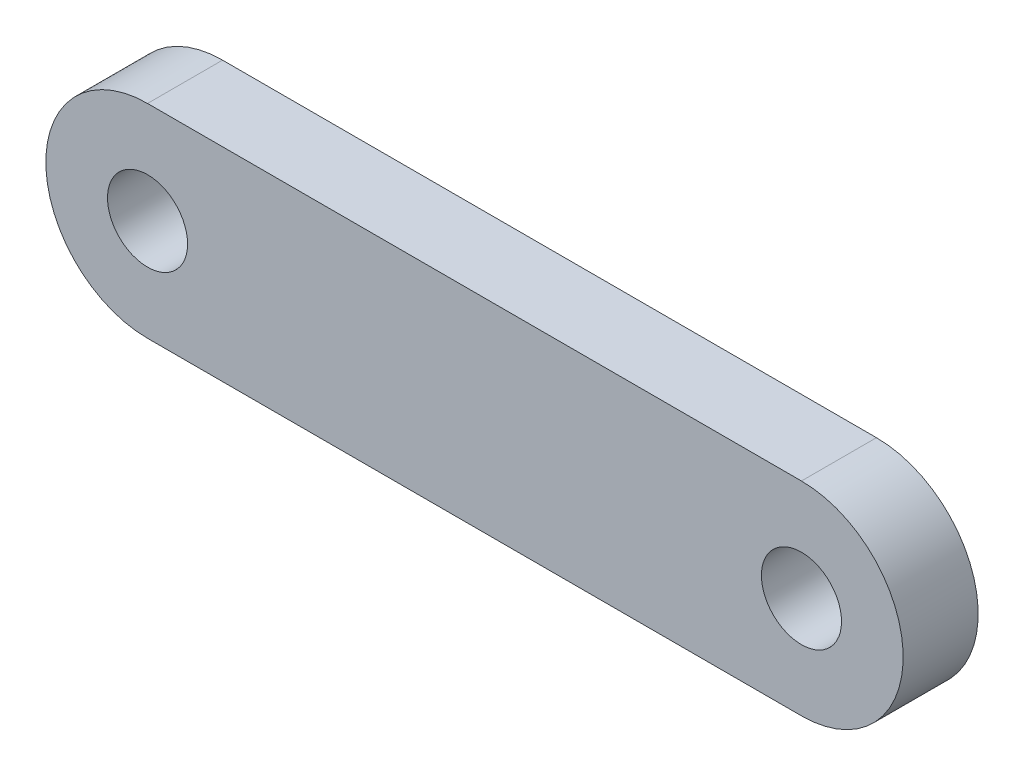
ISO-10303-21;
HEADER;
FILE_DESCRIPTION(('STEP AP214'),'2;1');
FILE_NAME('part.step','',(''),(''),'','','');
FILE_SCHEMA(('AUTOMOTIVE_DESIGN { 1 0 10303 214 1 1 1 1 }'));
ENDSEC;
DATA;
#1=APPLICATION_CONTEXT('core data for automotive mechanical design processes');
#2=APPLICATION_PROTOCOL_DEFINITION('international standard','automotive_design',2000,#1);
#3=PRODUCT_CONTEXT('',#1,'mechanical');
#4=PRODUCT('Part','Part','',(#3));
#5=PRODUCT_RELATED_PRODUCT_CATEGORY('part','',(#4));
#6=PRODUCT_DEFINITION_FORMATION('','',#4);
#7=PRODUCT_DEFINITION_CONTEXT('part definition',#1,'design');
#8=PRODUCT_DEFINITION('design','',#6,#7);
#9=PRODUCT_DEFINITION_SHAPE('','',#8);
#10=(LENGTH_UNIT() NAMED_UNIT(*) SI_UNIT(.MILLI.,.METRE.));
#11=(NAMED_UNIT(*) PLANE_ANGLE_UNIT() SI_UNIT($,.RADIAN.));
#12=(NAMED_UNIT(*) SI_UNIT($,.STERADIAN.) SOLID_ANGLE_UNIT());
#13=UNCERTAINTY_MEASURE_WITH_UNIT(LENGTH_MEASURE(1.E-05),#10,'distance_accuracy_value','');
#14=(GEOMETRIC_REPRESENTATION_CONTEXT(3) GLOBAL_UNCERTAINTY_ASSIGNED_CONTEXT((#13)) GLOBAL_UNIT_ASSIGNED_CONTEXT((#10,
#11,#12)) REPRESENTATION_CONTEXT('',''));
#15=CARTESIAN_POINT('',(0.,0.,0.));
#16=DIRECTION('',(0.,0.,1.));
#17=DIRECTION('',(1.,0.,0.));
#18=AXIS2_PLACEMENT_3D('',#15,#16,#17);
#19=CARTESIAN_POINT('',(25.7175,0.,5.9));
#20=DIRECTION('',(0.,0.,1.));
#21=DIRECTION('',(1.,0.,0.));
#22=AXIS2_PLACEMENT_3D('',#19,#20,#21);
#23=PLANE('',#22);
#24=CARTESIAN_POINT('',(25.7175,0.,5.9));
#25=DIRECTION('',(0.,0.,1.));
#26=DIRECTION('',(1.,0.,0.));
#27=AXIS2_PLACEMENT_3D('',#24,#25,#26);
#28=CIRCLE('',#27,3.15);
#29=CARTESIAN_POINT('',(28.8675,0.,5.9));
#30=VERTEX_POINT('',#29);
#31=EDGE_CURVE('E100',#30,#30,#28,.T.);
#32=ORIENTED_EDGE('',*,*,#31,.F.);
#33=EDGE_LOOP('',(#32));
#34=FACE_BOUND('',#33,.T.);
#35=CARTESIAN_POINT('',(25.7175,0.,5.9));
#36=DIRECTION('',(0.,0.,1.));
#37=DIRECTION('',(1.,0.,0.));
#38=AXIS2_PLACEMENT_3D('',#35,#36,#37);
#39=CIRCLE('',#38,8.);
#40=CARTESIAN_POINT('',(25.7175,-7.99999999999999,5.9));
#41=VERTEX_POINT('',#40);
#42=CARTESIAN_POINT('',(25.7175,8.00000000000001,5.9));
#43=VERTEX_POINT('',#42);
#44=EDGE_CURVE('E85',#41,#43,#39,.T.);
#45=ORIENTED_EDGE('',*,*,#44,.T.);
#46=DIRECTION('',(-1.,0.,0.));
#47=VECTOR('',#46,1.);
#48=CARTESIAN_POINT('',(25.7175,8.00000000000001,5.9));
#49=LINE('',#48,#47);
#50=CARTESIAN_POINT('',(-25.7175,8.,5.9));
#51=VERTEX_POINT('',#50);
#52=EDGE_CURVE('E80',#43,#51,#49,.T.);
#53=ORIENTED_EDGE('',*,*,#52,.T.);
#54=CARTESIAN_POINT('',(-25.7175,0.,5.9));
#55=DIRECTION('',(0.,0.,1.));
#56=DIRECTION('',(1.,0.,0.));
#57=AXIS2_PLACEMENT_3D('',#54,#55,#56);
#58=CIRCLE('',#57,8.);
#59=CARTESIAN_POINT('',(-25.7175,-8.00000000000001,5.9));
#60=VERTEX_POINT('',#59);
#61=EDGE_CURVE('E83',#51,#60,#58,.T.);
#62=ORIENTED_EDGE('',*,*,#61,.T.);
#63=DIRECTION('',(1.,0.,0.));
#64=VECTOR('',#63,1.);
#65=CARTESIAN_POINT('',(25.7175,-7.99999999999999,5.9));
#66=LINE('',#65,#64);
#67=EDGE_CURVE('E50',#60,#41,#66,.T.);
#68=ORIENTED_EDGE('',*,*,#67,.T.);
#69=EDGE_LOOP('',(#45,#53,#62,#68));
#70=FACE_BOUND('',#69,.T.);
#71=CARTESIAN_POINT('',(-25.7175,0.,5.9));
#72=DIRECTION('',(0.,0.,1.));
#73=DIRECTION('',(1.,0.,0.));
#74=AXIS2_PLACEMENT_3D('',#71,#72,#73);
#75=CIRCLE('',#74,3.15);
#76=CARTESIAN_POINT('',(-22.5675,0.,5.9));
#77=VERTEX_POINT('',#76);
#78=EDGE_CURVE('E115',#77,#77,#75,.T.);
#79=ORIENTED_EDGE('',*,*,#78,.F.);
#80=EDGE_LOOP('',(#79));
#81=FACE_BOUND('',#80,.T.);
#82=ADVANCED_FACE('F33',(#34,#70,#81),#23,.T.);
#83=CARTESIAN_POINT('',(25.7175,0.,0.));
#84=DIRECTION('',(0.,0.,1.));
#85=DIRECTION('',(1.,0.,0.));
#86=AXIS2_PLACEMENT_3D('',#83,#84,#85);
#87=PLANE('',#86);
#88=CARTESIAN_POINT('',(25.7175,0.,0.));
#89=DIRECTION('',(0.,0.,1.));
#90=DIRECTION('',(1.,0.,0.));
#91=AXIS2_PLACEMENT_3D('',#88,#89,#90);
#92=CIRCLE('',#91,8.);
#93=CARTESIAN_POINT('',(25.7175,-7.99999999999999,0.));
#94=VERTEX_POINT('',#93);
#95=CARTESIAN_POINT('',(25.7175,8.00000000000001,0.));
#96=VERTEX_POINT('',#95);
#97=EDGE_CURVE('E97',#94,#96,#92,.T.);
#98=ORIENTED_EDGE('',*,*,#97,.F.);
#99=DIRECTION('',(1.,0.,0.));
#100=VECTOR('',#99,1.);
#101=CARTESIAN_POINT('',(25.7175,-7.99999999999999,0.));
#102=LINE('',#101,#100);
#103=CARTESIAN_POINT('',(-25.7175,-8.00000000000001,0.));
#104=VERTEX_POINT('',#103);
#105=EDGE_CURVE('E73',#104,#94,#102,.T.);
#106=ORIENTED_EDGE('',*,*,#105,.F.);
#107=CARTESIAN_POINT('',(-25.7175,0.,0.));
#108=DIRECTION('',(0.,0.,1.));
#109=DIRECTION('',(1.,0.,0.));
#110=AXIS2_PLACEMENT_3D('',#107,#108,#109);
#111=CIRCLE('',#110,8.);
#112=CARTESIAN_POINT('',(-25.7175,8.,0.));
#113=VERTEX_POINT('',#112);
#114=EDGE_CURVE('E67',#113,#104,#111,.T.);
#115=ORIENTED_EDGE('',*,*,#114,.F.);
#116=DIRECTION('',(-1.,0.,0.));
#117=VECTOR('',#116,1.);
#118=CARTESIAN_POINT('',(25.7175,8.00000000000001,0.));
#119=LINE('',#118,#117);
#120=EDGE_CURVE('E89',#96,#113,#119,.T.);
#121=ORIENTED_EDGE('',*,*,#120,.F.);
#122=EDGE_LOOP('',(#98,#106,#115,#121));
#123=FACE_BOUND('',#122,.T.);
#124=CARTESIAN_POINT('',(25.7175,0.,0.));
#125=DIRECTION('',(0.,0.,1.));
#126=DIRECTION('',(1.,0.,0.));
#127=AXIS2_PLACEMENT_3D('',#124,#125,#126);
#128=CIRCLE('',#127,3.15);
#129=CARTESIAN_POINT('',(28.8675,0.,0.));
#130=VERTEX_POINT('',#129);
#131=EDGE_CURVE('E112',#130,#130,#128,.T.);
#132=ORIENTED_EDGE('',*,*,#131,.T.);
#133=EDGE_LOOP('',(#132));
#134=FACE_BOUND('',#133,.T.);
#135=CARTESIAN_POINT('',(-25.7175,0.,0.));
#136=DIRECTION('',(0.,0.,1.));
#137=DIRECTION('',(1.,0.,0.));
#138=AXIS2_PLACEMENT_3D('',#135,#136,#137);
#139=CIRCLE('',#138,3.15);
#140=CARTESIAN_POINT('',(-22.5675,0.,0.));
#141=VERTEX_POINT('',#140);
#142=EDGE_CURVE('E118',#141,#141,#139,.T.);
#143=ORIENTED_EDGE('',*,*,#142,.T.);
#144=EDGE_LOOP('',(#143));
#145=FACE_BOUND('',#144,.T.);
#146=ADVANCED_FACE('F108',(#123,#134,#145),#87,.F.);
#147=CARTESIAN_POINT('',(25.7175,0.,5.9));
#148=DIRECTION('',(0.,0.,-1.));
#149=DIRECTION('',(-1.,0.,0.));
#150=AXIS2_PLACEMENT_3D('',#147,#148,#149);
#151=CYLINDRICAL_SURFACE('',#150,8.);
#152=ORIENTED_EDGE('',*,*,#97,.T.);
#153=DIRECTION('',(0.,0.,-1.));
#154=VECTOR('',#153,1.);
#155=CARTESIAN_POINT('',(25.7175,8.00000000000001,5.9));
#156=LINE('',#155,#154);
#157=EDGE_CURVE('E11',#43,#96,#156,.T.);
#158=ORIENTED_EDGE('',*,*,#157,.F.);
#159=ORIENTED_EDGE('',*,*,#44,.F.);
#160=DIRECTION('',(0.,0.,-1.));
#161=VECTOR('',#160,1.);
#162=CARTESIAN_POINT('',(25.7175,-7.99999999999999,5.9));
#163=LINE('',#162,#161);
#164=EDGE_CURVE('E93',#41,#94,#163,.T.);
#165=ORIENTED_EDGE('',*,*,#164,.T.);
#166=EDGE_LOOP('',(#152,#158,#159,#165));
#167=FACE_BOUND('',#166,.T.);
#168=ADVANCED_FACE('F35',(#167),#151,.T.);
#169=CARTESIAN_POINT('',(25.7175,8.00000000000001,5.9));
#170=DIRECTION('',(0.,-1.,0.));
#171=DIRECTION('',(1.,0.,0.));
#172=AXIS2_PLACEMENT_3D('',#169,#170,#171);
#173=PLANE('',#172);
#174=ORIENTED_EDGE('',*,*,#120,.T.);
#175=DIRECTION('',(0.,0.,-1.));
#176=VECTOR('',#175,1.);
#177=CARTESIAN_POINT('',(-25.7175,8.,5.9));
#178=LINE('',#177,#176);
#179=EDGE_CURVE('E42',#51,#113,#178,.T.);
#180=ORIENTED_EDGE('',*,*,#179,.F.);
#181=ORIENTED_EDGE('',*,*,#52,.F.);
#182=ORIENTED_EDGE('',*,*,#157,.T.);
#183=EDGE_LOOP('',(#174,#180,#181,#182));
#184=FACE_BOUND('',#183,.T.);
#185=ADVANCED_FACE('F88',(#184),#173,.F.);
#186=CARTESIAN_POINT('',(-25.7175,0.,5.9));
#187=DIRECTION('',(0.,0.,-1.));
#188=DIRECTION('',(-1.,0.,0.));
#189=AXIS2_PLACEMENT_3D('',#186,#187,#188);
#190=CYLINDRICAL_SURFACE('',#189,8.);
#191=ORIENTED_EDGE('',*,*,#114,.T.);
#192=DIRECTION('',(0.,0.,-1.));
#193=VECTOR('',#192,1.);
#194=CARTESIAN_POINT('',(-25.7175,-8.00000000000001,5.9));
#195=LINE('',#194,#193);
#196=EDGE_CURVE('E90',#60,#104,#195,.T.);
#197=ORIENTED_EDGE('',*,*,#196,.F.);
#198=ORIENTED_EDGE('',*,*,#61,.F.);
#199=ORIENTED_EDGE('',*,*,#179,.T.);
#200=EDGE_LOOP('',(#191,#197,#198,#199));
#201=FACE_BOUND('',#200,.T.);
#202=ADVANCED_FACE('F91',(#201),#190,.T.);
#203=CARTESIAN_POINT('',(25.7175,-7.99999999999999,5.9));
#204=DIRECTION('',(0.,1.,0.));
#205=DIRECTION('',(-1.,0.,0.));
#206=AXIS2_PLACEMENT_3D('',#203,#204,#205);
#207=PLANE('',#206);
#208=ORIENTED_EDGE('',*,*,#105,.T.);
#209=ORIENTED_EDGE('',*,*,#164,.F.);
#210=ORIENTED_EDGE('',*,*,#67,.F.);
#211=ORIENTED_EDGE('',*,*,#196,.T.);
#212=EDGE_LOOP('',(#208,#209,#210,#211));
#213=FACE_BOUND('',#212,.T.);
#214=ADVANCED_FACE('F105',(#213),#207,.F.);
#215=CARTESIAN_POINT('',(25.7175,0.,5.9));
#216=DIRECTION('',(0.,0.,-1.));
#217=DIRECTION('',(-1.,0.,0.));
#218=AXIS2_PLACEMENT_3D('',#215,#216,#217);
#219=CYLINDRICAL_SURFACE('',#218,3.15);
#220=ORIENTED_EDGE('',*,*,#31,.T.);
#221=EDGE_LOOP('',(#220));
#222=FACE_BOUND('',#221,.T.);
#223=ORIENTED_EDGE('',*,*,#131,.F.);
#224=EDGE_LOOP('',(#223));
#225=FACE_BOUND('',#224,.T.);
#226=ADVANCED_FACE('F135',(#222,#225),#219,.F.);
#227=CARTESIAN_POINT('',(-25.7175,0.,5.9));
#228=DIRECTION('',(0.,0.,-1.));
#229=DIRECTION('',(-1.,0.,0.));
#230=AXIS2_PLACEMENT_3D('',#227,#228,#229);
#231=CYLINDRICAL_SURFACE('',#230,3.15);
#232=ORIENTED_EDGE('',*,*,#78,.T.);
#233=EDGE_LOOP('',(#232));
#234=FACE_BOUND('',#233,.T.);
#235=ORIENTED_EDGE('',*,*,#142,.F.);
#236=EDGE_LOOP('',(#235));
#237=FACE_BOUND('',#236,.T.);
#238=ADVANCED_FACE('F124',(#234,#237),#231,.F.);
#239=CLOSED_SHELL('',(#82,#146,#168,#185,#202,#214,#226,#238));
#240=MANIFOLD_SOLID_BREP('B2',#239);
#241=ADVANCED_BREP_SHAPE_REPRESENTATION('',(#18,#240),#14);
#242=SHAPE_DEFINITION_REPRESENTATION(#9,#241);
ENDSEC;
END-ISO-10303-21;
